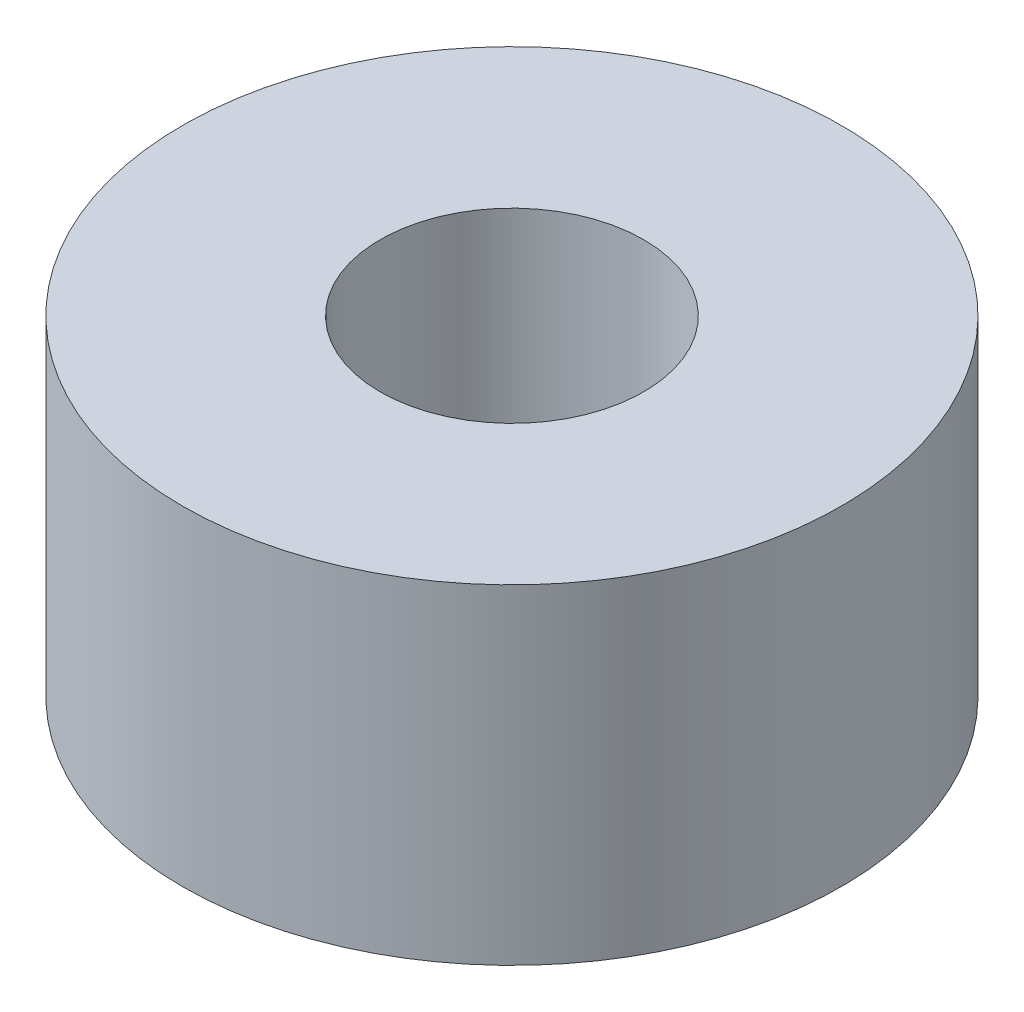
ISO-10303-21;
HEADER;
FILE_DESCRIPTION(('STEP AP214'),'2;1');
FILE_NAME('part.step','',(''),(''),'','','');
FILE_SCHEMA(('AUTOMOTIVE_DESIGN { 1 0 10303 214 1 1 1 1 }'));
ENDSEC;
DATA;
#1=APPLICATION_CONTEXT('core data for automotive mechanical design processes');
#2=APPLICATION_PROTOCOL_DEFINITION('international standard','automotive_design',2000,#1);
#3=PRODUCT_CONTEXT('',#1,'mechanical');
#4=PRODUCT('Part','Part','',(#3));
#5=PRODUCT_RELATED_PRODUCT_CATEGORY('part','',(#4));
#6=PRODUCT_DEFINITION_FORMATION('','',#4);
#7=PRODUCT_DEFINITION_CONTEXT('part definition',#1,'design');
#8=PRODUCT_DEFINITION('design','',#6,#7);
#9=PRODUCT_DEFINITION_SHAPE('','',#8);
#10=(LENGTH_UNIT() NAMED_UNIT(*) SI_UNIT(.MILLI.,.METRE.));
#11=(NAMED_UNIT(*) PLANE_ANGLE_UNIT() SI_UNIT($,.RADIAN.));
#12=(NAMED_UNIT(*) SI_UNIT($,.STERADIAN.) SOLID_ANGLE_UNIT());
#13=UNCERTAINTY_MEASURE_WITH_UNIT(LENGTH_MEASURE(1.E-05),#10,'distance_accuracy_value','');
#14=(GEOMETRIC_REPRESENTATION_CONTEXT(3) GLOBAL_UNCERTAINTY_ASSIGNED_CONTEXT((#13)) GLOBAL_UNIT_ASSIGNED_CONTEXT((#10,
#11,#12)) REPRESENTATION_CONTEXT('',''));
#15=CARTESIAN_POINT('',(0.,0.,0.));
#16=DIRECTION('',(0.,0.,1.));
#17=DIRECTION('',(1.,0.,0.));
#18=AXIS2_PLACEMENT_3D('',#15,#16,#17);
#19=CARTESIAN_POINT('',(0.,10.,0.));
#20=DIRECTION('',(0.,1.,0.));
#21=DIRECTION('',(0.,0.,1.));
#22=AXIS2_PLACEMENT_3D('',#19,#20,#21);
#23=PLANE('',#22);
#24=CARTESIAN_POINT('',(0.,10.,0.));
#25=DIRECTION('',(0.,1.,0.));
#26=DIRECTION('',(0.,0.,1.));
#27=AXIS2_PLACEMENT_3D('',#24,#25,#26);
#28=CIRCLE('',#27,10.);
#29=CARTESIAN_POINT('',(0.,10.,10.));
#30=VERTEX_POINT('',#29);
#31=EDGE_CURVE('E10',#30,#30,#28,.T.);
#32=ORIENTED_EDGE('',*,*,#31,.T.);
#33=EDGE_LOOP('',(#32));
#34=FACE_BOUND('',#33,.T.);
#35=CARTESIAN_POINT('',(0.,10.,0.));
#36=DIRECTION('',(0.,1.,0.));
#37=DIRECTION('',(0.,0.,1.));
#38=AXIS2_PLACEMENT_3D('',#35,#36,#37);
#39=CIRCLE('',#38,4.);
#40=CARTESIAN_POINT('',(0.,10.,4.));
#41=VERTEX_POINT('',#40);
#42=EDGE_CURVE('E46',#41,#41,#39,.T.);
#43=ORIENTED_EDGE('',*,*,#42,.F.);
#44=EDGE_LOOP('',(#43));
#45=FACE_BOUND('',#44,.T.);
#46=ADVANCED_FACE('F35',(#34,#45),#23,.T.);
#47=CARTESIAN_POINT('',(0.,0.,0.));
#48=DIRECTION('',(0.,1.,0.));
#49=DIRECTION('',(0.,0.,1.));
#50=AXIS2_PLACEMENT_3D('',#47,#48,#49);
#51=PLANE('',#50);
#52=CARTESIAN_POINT('',(0.,0.,0.));
#53=DIRECTION('',(0.,1.,0.));
#54=DIRECTION('',(0.,0.,1.));
#55=AXIS2_PLACEMENT_3D('',#52,#53,#54);
#56=CIRCLE('',#55,10.);
#57=CARTESIAN_POINT('',(0.,0.,10.));
#58=VERTEX_POINT('',#57);
#59=EDGE_CURVE('E39',#58,#58,#56,.T.);
#60=ORIENTED_EDGE('',*,*,#59,.F.);
#61=EDGE_LOOP('',(#60));
#62=FACE_BOUND('',#61,.T.);
#63=CARTESIAN_POINT('',(0.,0.,0.));
#64=DIRECTION('',(0.,1.,0.));
#65=DIRECTION('',(0.,0.,1.));
#66=AXIS2_PLACEMENT_3D('',#63,#64,#65);
#67=CIRCLE('',#66,4.);
#68=CARTESIAN_POINT('',(0.,0.,4.));
#69=VERTEX_POINT('',#68);
#70=EDGE_CURVE('E48',#69,#69,#67,.T.);
#71=ORIENTED_EDGE('',*,*,#70,.T.);
#72=EDGE_LOOP('',(#71));
#73=FACE_BOUND('',#72,.T.);
#74=ADVANCED_FACE('F58',(#62,#73),#51,.F.);
#75=CARTESIAN_POINT('',(0.,10.,0.));
#76=DIRECTION('',(0.,-1.,0.));
#77=DIRECTION('',(0.,0.,-1.));
#78=AXIS2_PLACEMENT_3D('',#75,#76,#77);
#79=CYLINDRICAL_SURFACE('',#78,10.);
#80=ORIENTED_EDGE('',*,*,#31,.F.);
#81=EDGE_LOOP('',(#80));
#82=FACE_BOUND('',#81,.T.);
#83=ORIENTED_EDGE('',*,*,#59,.T.);
#84=EDGE_LOOP('',(#83));
#85=FACE_BOUND('',#84,.T.);
#86=ADVANCED_FACE('F37',(#82,#85),#79,.T.);
#87=CARTESIAN_POINT('',(0.,10.,0.));
#88=DIRECTION('',(0.,-1.,0.));
#89=DIRECTION('',(0.,0.,-1.));
#90=AXIS2_PLACEMENT_3D('',#87,#88,#89);
#91=CYLINDRICAL_SURFACE('',#90,4.);
#92=ORIENTED_EDGE('',*,*,#42,.T.);
#93=EDGE_LOOP('',(#92));
#94=FACE_BOUND('',#93,.T.);
#95=ORIENTED_EDGE('',*,*,#70,.F.);
#96=EDGE_LOOP('',(#95));
#97=FACE_BOUND('',#96,.T.);
#98=ADVANCED_FACE('F54',(#94,#97),#91,.F.);
#99=CLOSED_SHELL('',(#46,#74,#86,#98));
#100=MANIFOLD_SOLID_BREP('B2',#99);
#101=ADVANCED_BREP_SHAPE_REPRESENTATION('',(#18,#100),#14);
#102=SHAPE_DEFINITION_REPRESENTATION(#9,#101);
ENDSEC;
END-ISO-10303-21;
